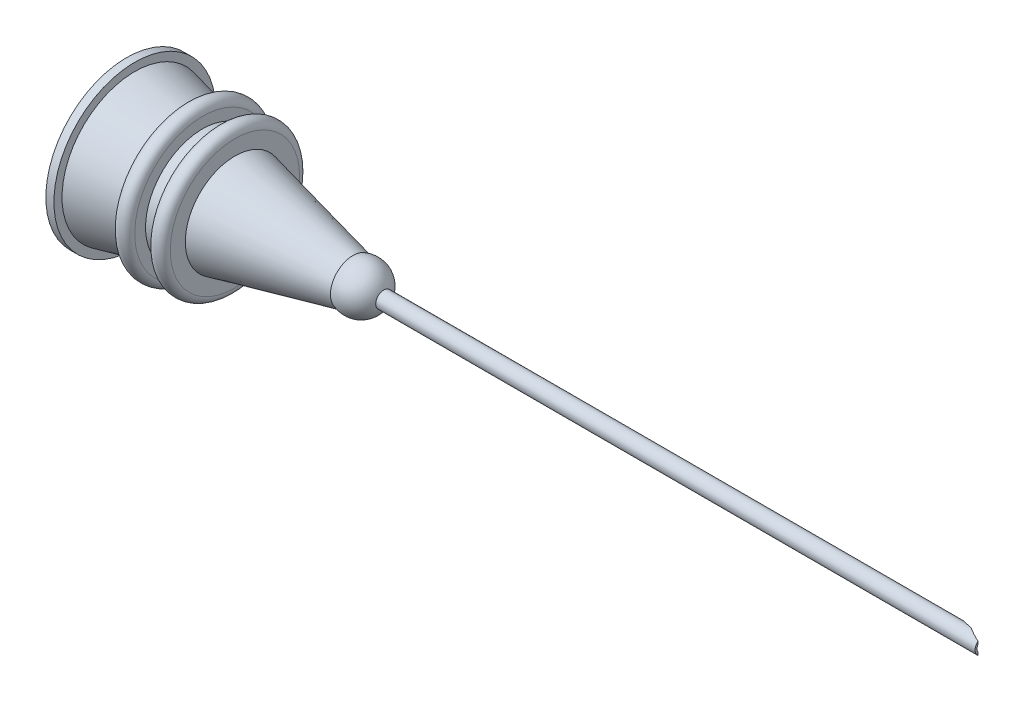
ISO-10303-21;
HEADER;
FILE_DESCRIPTION(('STEP AP214'),'2;1');
FILE_NAME('part.step','',(''),(''),'','','');
FILE_SCHEMA(('AUTOMOTIVE_DESIGN { 1 0 10303 214 1 1 1 1 }'));
ENDSEC;
DATA;
#1=APPLICATION_CONTEXT('core data for automotive mechanical design processes');
#2=APPLICATION_PROTOCOL_DEFINITION('international standard','automotive_design',2000,#1);
#3=PRODUCT_CONTEXT('',#1,'mechanical');
#4=PRODUCT('Part','Part','',(#3));
#5=PRODUCT_RELATED_PRODUCT_CATEGORY('part','',(#4));
#6=PRODUCT_DEFINITION_FORMATION('','',#4);
#7=PRODUCT_DEFINITION_CONTEXT('part definition',#1,'design');
#8=PRODUCT_DEFINITION('design','',#6,#7);
#9=PRODUCT_DEFINITION_SHAPE('','',#8);
#10=(LENGTH_UNIT() NAMED_UNIT(*) SI_UNIT(.MILLI.,.METRE.));
#11=(NAMED_UNIT(*) PLANE_ANGLE_UNIT() SI_UNIT($,.RADIAN.));
#12=(NAMED_UNIT(*) SI_UNIT($,.STERADIAN.) SOLID_ANGLE_UNIT());
#13=UNCERTAINTY_MEASURE_WITH_UNIT(LENGTH_MEASURE(1.E-05),#10,'distance_accuracy_value','');
#14=(GEOMETRIC_REPRESENTATION_CONTEXT(3) GLOBAL_UNCERTAINTY_ASSIGNED_CONTEXT((#13)) GLOBAL_UNIT_ASSIGNED_CONTEXT((#10,
#11,#12)) REPRESENTATION_CONTEXT('',''));
#15=CARTESIAN_POINT('',(0.,0.,0.));
#16=DIRECTION('',(0.,0.,1.));
#17=DIRECTION('',(1.,0.,0.));
#18=AXIS2_PLACEMENT_3D('',#15,#16,#17);
#19=CARTESIAN_POINT('',(0.517813696824794,0.,0.));
#20=DIRECTION('',(0.,0.,1.));
#21=DIRECTION('',(1.,0.,0.));
#22=AXIS2_PLACEMENT_3D('',#19,#20,#21);
#23=SPHERICAL_SURFACE('',#22,1.48218630317521);
#24=CARTESIAN_POINT('',(0.517813696824794,0.,0.));
#25=DIRECTION('',(-1.,0.,0.));
#26=DIRECTION('',(0.,0.,1.));
#27=AXIS2_PLACEMENT_3D('',#24,#25,#26);
#28=SPHERICAL_SURFACE('',#27,1.48218630317521);
#29=CARTESIAN_POINT('',(1.91311876644942,0.,0.));
#30=DIRECTION('',(-1.,0.,0.));
#31=DIRECTION('',(0.,0.,1.));
#32=AXIS2_PLACEMENT_3D('',#29,#30,#31);
#33=CIRCLE('',#32,0.5);
#34=CARTESIAN_POINT('',(1.91311876644942,0.,0.5));
#35=VERTEX_POINT('',#34);
#36=EDGE_CURVE('E116',#35,#35,#33,.F.);
#37=ORIENTED_EDGE('',*,*,#36,.F.);
#38=EDGE_LOOP('',(#37));
#39=FACE_BOUND('',#38,.T.);
#40=CARTESIAN_POINT('',(0.,0.,0.));
#41=DIRECTION('',(1.,0.,0.));
#42=DIRECTION('',(0.,0.,-1.));
#43=AXIS2_PLACEMENT_3D('',#40,#41,#42);
#44=CIRCLE('',#43,1.38879271768714);
#45=CARTESIAN_POINT('',(0.,0.,-1.38879271768714));
#46=VERTEX_POINT('',#45);
#47=EDGE_CURVE('E104',#46,#46,#44,.T.);
#48=ORIENTED_EDGE('',*,*,#47,.T.);
#49=EDGE_LOOP('',(#48));
#50=FACE_BOUND('',#49,.T.);
#51=ADVANCED_FACE('F45',(#39,#50),#28,.T.);
#52=CARTESIAN_POINT('',(0.,0.,0.));
#53=DIRECTION('',(-1.,0.,0.));
#54=DIRECTION('',(0.,0.,1.));
#55=AXIS2_PLACEMENT_3D('',#52,#53,#54);
#56=CONICAL_SURFACE('',#55,1.38879271768714,0.226465864034917);
#57=CARTESIAN_POINT('',(-7.3,0.,0.));
#58=DIRECTION('',(1.,0.,0.));
#59=DIRECTION('',(0.,0.,-1.));
#60=AXIS2_PLACEMENT_3D('',#57,#58,#59);
#61=CIRCLE('',#60,3.07084806558869);
#62=CARTESIAN_POINT('',(-7.3,0.,-3.07084806558869));
#63=VERTEX_POINT('',#62);
#64=EDGE_CURVE('E107',#63,#63,#61,.T.);
#65=ORIENTED_EDGE('',*,*,#64,.T.);
#66=EDGE_LOOP('',(#65));
#67=FACE_BOUND('',#66,.T.);
#68=ORIENTED_EDGE('',*,*,#47,.F.);
#69=EDGE_LOOP('',(#68));
#70=FACE_BOUND('',#69,.T.);
#71=ADVANCED_FACE('F199',(#67,#70),#56,.T.);
#72=CARTESIAN_POINT('',(-7.3,4.,0.));
#73=DIRECTION('',(1.,0.,0.));
#74=DIRECTION('',(0.,0.,-1.));
#75=AXIS2_PLACEMENT_3D('',#72,#73,#74);
#76=PLANE('',#75);
#77=CARTESIAN_POINT('',(-7.3,0.,0.));
#78=DIRECTION('',(1.,0.,0.));
#79=DIRECTION('',(0.,0.,-1.));
#80=AXIS2_PLACEMENT_3D('',#77,#78,#79);
#81=CIRCLE('',#80,4.);
#82=CARTESIAN_POINT('',(-7.3,0.,-4.));
#83=VERTEX_POINT('',#82);
#84=EDGE_CURVE('E214',#83,#83,#81,.T.);
#85=ORIENTED_EDGE('',*,*,#84,.T.);
#86=EDGE_LOOP('',(#85));
#87=FACE_BOUND('',#86,.T.);
#88=ORIENTED_EDGE('',*,*,#64,.F.);
#89=EDGE_LOOP('',(#88));
#90=FACE_BOUND('',#89,.T.);
#91=ADVANCED_FACE('F196',(#87,#90),#76,.T.);
#92=CARTESIAN_POINT('',(-7.8,0.,0.));
#93=DIRECTION('',(1.,0.,0.));
#94=DIRECTION('',(0.,0.,-1.));
#95=AXIS2_PLACEMENT_3D('',#92,#93,#94);
#96=TOROIDAL_SURFACE('',#95,4.,0.5);
#97=CARTESIAN_POINT('',(-8.3,0.,0.));
#98=DIRECTION('',(1.,0.,0.));
#99=DIRECTION('',(0.,0.,-1.));
#100=AXIS2_PLACEMENT_3D('',#97,#98,#99);
#101=CIRCLE('',#100,4.);
#102=CARTESIAN_POINT('',(-8.3,0.,-4.));
#103=VERTEX_POINT('',#102);
#104=EDGE_CURVE('E218',#103,#103,#101,.T.);
#105=ORIENTED_EDGE('',*,*,#104,.T.);
#106=EDGE_LOOP('',(#105));
#107=FACE_BOUND('',#106,.T.);
#108=ORIENTED_EDGE('',*,*,#84,.F.);
#109=EDGE_LOOP('',(#108));
#110=FACE_BOUND('',#109,.T.);
#111=ADVANCED_FACE('F192',(#107,#110),#96,.T.);
#112=CARTESIAN_POINT('',(-8.3,4.,0.));
#113=DIRECTION('',(-1.,0.,0.));
#114=DIRECTION('',(0.,0.,1.));
#115=AXIS2_PLACEMENT_3D('',#112,#113,#114);
#116=PLANE('',#115);
#117=CARTESIAN_POINT('',(-8.3,0.,0.));
#118=DIRECTION('',(1.,0.,0.));
#119=DIRECTION('',(0.,0.,-1.));
#120=AXIS2_PLACEMENT_3D('',#117,#118,#119);
#121=CIRCLE('',#120,3.30126660639712);
#122=CARTESIAN_POINT('',(-8.3,0.,-3.30126660639712));
#123=VERTEX_POINT('',#122);
#124=EDGE_CURVE('E224',#123,#123,#121,.T.);
#125=ORIENTED_EDGE('',*,*,#124,.T.);
#126=EDGE_LOOP('',(#125));
#127=FACE_BOUND('',#126,.T.);
#128=ORIENTED_EDGE('',*,*,#104,.F.);
#129=EDGE_LOOP('',(#128));
#130=FACE_BOUND('',#129,.T.);
#131=ADVANCED_FACE('F188',(#127,#130),#116,.T.);
#132=CARTESIAN_POINT('',(-8.3,0.,0.));
#133=DIRECTION('',(-1.,0.,0.));
#134=DIRECTION('',(0.,0.,1.));
#135=AXIS2_PLACEMENT_3D('',#132,#133,#134);
#136=CONICAL_SURFACE('',#135,3.30126660639712,0.226465864034917);
#137=CARTESIAN_POINT('',(-9.3,0.,0.));
#138=DIRECTION('',(1.,0.,0.));
#139=DIRECTION('',(0.,0.,-1.));
#140=AXIS2_PLACEMENT_3D('',#137,#138,#139);
#141=CIRCLE('',#140,3.53168514720555);
#142=CARTESIAN_POINT('',(-9.3,0.,-3.53168514720555));
#143=VERTEX_POINT('',#142);
#144=EDGE_CURVE('E228',#143,#143,#141,.T.);
#145=ORIENTED_EDGE('',*,*,#144,.T.);
#146=EDGE_LOOP('',(#145));
#147=FACE_BOUND('',#146,.T.);
#148=ORIENTED_EDGE('',*,*,#124,.F.);
#149=EDGE_LOOP('',(#148));
#150=FACE_BOUND('',#149,.T.);
#151=ADVANCED_FACE('F184',(#147,#150),#136,.T.);
#152=CARTESIAN_POINT('',(-9.3,4.2,0.));
#153=DIRECTION('',(1.,0.,0.));
#154=DIRECTION('',(0.,0.,-1.));
#155=AXIS2_PLACEMENT_3D('',#152,#153,#154);
#156=PLANE('',#155);
#157=CARTESIAN_POINT('',(-9.3,0.,0.));
#158=DIRECTION('',(1.,0.,0.));
#159=DIRECTION('',(0.,0.,-1.));
#160=AXIS2_PLACEMENT_3D('',#157,#158,#159);
#161=CIRCLE('',#160,4.2);
#162=CARTESIAN_POINT('',(-9.3,0.,-4.2));
#163=VERTEX_POINT('',#162);
#164=EDGE_CURVE('E232',#163,#163,#161,.T.);
#165=ORIENTED_EDGE('',*,*,#164,.T.);
#166=EDGE_LOOP('',(#165));
#167=FACE_BOUND('',#166,.T.);
#168=ORIENTED_EDGE('',*,*,#144,.F.);
#169=EDGE_LOOP('',(#168));
#170=FACE_BOUND('',#169,.T.);
#171=ADVANCED_FACE('F180',(#167,#170),#156,.T.);
#172=CARTESIAN_POINT('',(-9.8,0.,0.));
#173=DIRECTION('',(1.,0.,0.));
#174=DIRECTION('',(0.,0.,-1.));
#175=AXIS2_PLACEMENT_3D('',#172,#173,#174);
#176=TOROIDAL_SURFACE('',#175,4.2,0.5);
#177=CARTESIAN_POINT('',(-10.3,0.,0.));
#178=DIRECTION('',(1.,0.,0.));
#179=DIRECTION('',(0.,0.,-1.));
#180=AXIS2_PLACEMENT_3D('',#177,#178,#179);
#181=CIRCLE('',#180,4.2);
#182=CARTESIAN_POINT('',(-10.3,0.,-4.2));
#183=VERTEX_POINT('',#182);
#184=EDGE_CURVE('E236',#183,#183,#181,.T.);
#185=ORIENTED_EDGE('',*,*,#184,.T.);
#186=EDGE_LOOP('',(#185));
#187=FACE_BOUND('',#186,.T.);
#188=ORIENTED_EDGE('',*,*,#164,.F.);
#189=EDGE_LOOP('',(#188));
#190=FACE_BOUND('',#189,.T.);
#191=ADVANCED_FACE('F176',(#187,#190),#176,.T.);
#192=CARTESIAN_POINT('',(-10.3,4.2,0.));
#193=DIRECTION('',(-1.,0.,0.));
#194=DIRECTION('',(0.,0.,1.));
#195=AXIS2_PLACEMENT_3D('',#192,#193,#194);
#196=PLANE('',#195);
#197=CARTESIAN_POINT('',(-10.3,0.,0.));
#198=DIRECTION('',(1.,0.,0.));
#199=DIRECTION('',(0.,0.,-1.));
#200=AXIS2_PLACEMENT_3D('',#197,#198,#199);
#201=CIRCLE('',#200,3.76210368801398);
#202=CARTESIAN_POINT('',(-10.3,0.,-3.76210368801398));
#203=VERTEX_POINT('',#202);
#204=EDGE_CURVE('E240',#203,#203,#201,.T.);
#205=ORIENTED_EDGE('',*,*,#204,.T.);
#206=EDGE_LOOP('',(#205));
#207=FACE_BOUND('',#206,.T.);
#208=ORIENTED_EDGE('',*,*,#184,.F.);
#209=EDGE_LOOP('',(#208));
#210=FACE_BOUND('',#209,.T.);
#211=ADVANCED_FACE('F172',(#207,#210),#196,.T.);
#212=CARTESIAN_POINT('',(-10.3,0.,0.));
#213=DIRECTION('',(-1.,0.,0.));
#214=DIRECTION('',(0.,0.,1.));
#215=AXIS2_PLACEMENT_3D('',#212,#213,#214);
#216=CONICAL_SURFACE('',#215,3.76210368801398,0.226465864034916);
#217=CARTESIAN_POINT('',(-13.5,0.,0.));
#218=DIRECTION('',(1.,0.,0.));
#219=DIRECTION('',(0.,0.,-1.));
#220=AXIS2_PLACEMENT_3D('',#217,#218,#219);
#221=CIRCLE('',#220,4.49944301860096);
#222=CARTESIAN_POINT('',(-13.5,0.,-4.49944301860096));
#223=VERTEX_POINT('',#222);
#224=EDGE_CURVE('E244',#223,#223,#221,.T.);
#225=ORIENTED_EDGE('',*,*,#224,.T.);
#226=EDGE_LOOP('',(#225));
#227=FACE_BOUND('',#226,.T.);
#228=ORIENTED_EDGE('',*,*,#204,.F.);
#229=EDGE_LOOP('',(#228));
#230=FACE_BOUND('',#229,.T.);
#231=ADVANCED_FACE('F168',(#227,#230),#216,.T.);
#232=CARTESIAN_POINT('',(-13.5,4.49944301860096,0.));
#233=DIRECTION('',(1.,0.,0.));
#234=DIRECTION('',(0.,0.,-1.));
#235=AXIS2_PLACEMENT_3D('',#232,#233,#234);
#236=PLANE('',#235);
#237=CARTESIAN_POINT('',(-13.5,0.,0.));
#238=DIRECTION('',(1.,0.,0.));
#239=DIRECTION('',(0.,0.,-1.));
#240=AXIS2_PLACEMENT_3D('',#237,#238,#239);
#241=CIRCLE('',#240,5.);
#242=CARTESIAN_POINT('',(-13.5,0.,-5.));
#243=VERTEX_POINT('',#242);
#244=EDGE_CURVE('E248',#243,#243,#241,.T.);
#245=ORIENTED_EDGE('',*,*,#244,.T.);
#246=EDGE_LOOP('',(#245));
#247=FACE_BOUND('',#246,.T.);
#248=ORIENTED_EDGE('',*,*,#224,.F.);
#249=EDGE_LOOP('',(#248));
#250=FACE_BOUND('',#249,.T.);
#251=ADVANCED_FACE('F164',(#247,#250),#236,.T.);
#252=CARTESIAN_POINT('',(-1.,0.,0.));
#253=DIRECTION('',(1.,0.,0.));
#254=DIRECTION('',(0.,0.,-1.));
#255=AXIS2_PLACEMENT_3D('',#252,#253,#254);
#256=CYLINDRICAL_SURFACE('',#255,5.);
#257=CARTESIAN_POINT('',(-14.,0.,0.));
#258=DIRECTION('',(1.,0.,0.));
#259=DIRECTION('',(0.,0.,-1.));
#260=AXIS2_PLACEMENT_3D('',#257,#258,#259);
#261=CIRCLE('',#260,5.);
#262=CARTESIAN_POINT('',(-14.,0.,-5.));
#263=VERTEX_POINT('',#262);
#264=EDGE_CURVE('E252',#263,#263,#261,.T.);
#265=ORIENTED_EDGE('',*,*,#264,.T.);
#266=EDGE_LOOP('',(#265));
#267=FACE_BOUND('',#266,.T.);
#268=ORIENTED_EDGE('',*,*,#244,.F.);
#269=EDGE_LOOP('',(#268));
#270=FACE_BOUND('',#269,.T.);
#271=ADVANCED_FACE('F160',(#267,#270),#256,.T.);
#272=CARTESIAN_POINT('',(-14.,5.,0.));
#273=DIRECTION('',(-1.,0.,0.));
#274=DIRECTION('',(0.,0.,1.));
#275=AXIS2_PLACEMENT_3D('',#272,#273,#274);
#276=PLANE('',#275);
#277=CARTESIAN_POINT('',(-14.,0.,0.));
#278=DIRECTION('',(1.,0.,0.));
#279=DIRECTION('',(0.,0.,-1.));
#280=AXIS2_PLACEMENT_3D('',#277,#278,#279);
#281=CIRCLE('',#280,3.845);
#282=CARTESIAN_POINT('',(-14.,0.,3.845));
#283=VERTEX_POINT('',#282);
#284=EDGE_CURVE('E256',#283,#283,#281,.T.);
#285=ORIENTED_EDGE('',*,*,#284,.T.);
#286=EDGE_LOOP('',(#285));
#287=FACE_BOUND('',#286,.T.);
#288=ORIENTED_EDGE('',*,*,#264,.F.);
#289=EDGE_LOOP('',(#288));
#290=FACE_BOUND('',#289,.T.);
#291=ADVANCED_FACE('F156',(#287,#290),#276,.T.);
#292=CARTESIAN_POINT('',(-14.,0.,0.));
#293=DIRECTION('',(-1.,0.,0.));
#294=DIRECTION('',(0.,0.,1.));
#295=AXIS2_PLACEMENT_3D('',#292,#293,#294);
#296=CONICAL_SURFACE('',#295,3.845,0.226465864034917);
#297=CARTESIAN_POINT('',(-1.,0.,0.));
#298=DIRECTION('',(1.,0.,0.));
#299=DIRECTION('',(0.,0.,-1.));
#300=AXIS2_PLACEMENT_3D('',#297,#298,#299);
#301=CIRCLE('',#300,0.84955896949039);
#302=CARTESIAN_POINT('',(-1.,0.,0.84955896949039));
#303=VERTEX_POINT('',#302);
#304=EDGE_CURVE('E260',#303,#303,#301,.T.);
#305=CARTESIAN_POINT('',(-1.,0.,0.84955896949039));
#306=CARTESIAN_POINT('',(-1.13541666666667,0.,0.880761480224865));
#307=CARTESIAN_POINT('',(-1.27083333333333,0.,0.91196399095934));
#308=CARTESIAN_POINT('',(-1.54166666666667,0.,0.974369012428291));
#309=CARTESIAN_POINT('',(-1.67708333333333,0.,1.00557152316277));
#310=CARTESIAN_POINT('',(-1.94791666666667,0.,1.06797654463172));
#311=CARTESIAN_POINT('',(-2.08333333333334,0.,1.09917905536619));
#312=CARTESIAN_POINT('',(-2.35416666666667,0.,1.16158407683514));
#313=CARTESIAN_POINT('',(-2.48958333333333,0.,1.19278658756962));
#314=CARTESIAN_POINT('',(-2.76041666666667,0.,1.25519160903857));
#315=CARTESIAN_POINT('',(-2.89583333333333,0.,1.28639411977304));
#316=CARTESIAN_POINT('',(-3.16666666666667,0.,1.34879914124199));
#317=CARTESIAN_POINT('',(-3.30208333333333,0.,1.38000165197647));
#318=CARTESIAN_POINT('',(-3.57291666666667,0.,1.44240667344542));
#319=CARTESIAN_POINT('',(-3.70833333333333,0.,1.47360918417989));
#320=CARTESIAN_POINT('',(-3.97916666666667,0.,1.53601420564884));
#321=CARTESIAN_POINT('',(-4.11458333333334,0.,1.56721671638332));
#322=CARTESIAN_POINT('',(-4.38541666666667,0.,1.62962173785227));
#323=CARTESIAN_POINT('',(-4.52083333333333,0.,1.66082424858674));
#324=CARTESIAN_POINT('',(-4.79166666666667,0.,1.72322927005569));
#325=CARTESIAN_POINT('',(-4.92708333333333,0.,1.75443178079017));
#326=CARTESIAN_POINT('',(-5.19791666666667,0.,1.81683680225912));
#327=CARTESIAN_POINT('',(-5.33333333333333,0.,1.84803931299359));
#328=CARTESIAN_POINT('',(-5.60416666666667,0.,1.91044433446254));
#329=CARTESIAN_POINT('',(-5.73958333333333,0.,1.94164684519702));
#330=CARTESIAN_POINT('',(-6.01041666666667,0.,2.00405186666597));
#331=CARTESIAN_POINT('',(-6.14583333333334,0.,2.03525437740044));
#332=CARTESIAN_POINT('',(-6.41666666666667,0.,2.0976593988694));
#333=CARTESIAN_POINT('',(-6.55208333333334,0.,2.12886190960387));
#334=CARTESIAN_POINT('',(-6.82291666666667,0.,2.19126693107282));
#335=CARTESIAN_POINT('',(-6.95833333333334,0.,2.2224694418073));
#336=CARTESIAN_POINT('',(-7.22916666666667,0.,2.28487446327625));
#337=CARTESIAN_POINT('',(-7.36458333333334,0.,2.31607697401072));
#338=CARTESIAN_POINT('',(-7.63541666666667,0.,2.37848199547967));
#339=CARTESIAN_POINT('',(-7.77083333333334,0.,2.40968450621415));
#340=CARTESIAN_POINT('',(-8.04166666666667,0.,2.4720895276831));
#341=CARTESIAN_POINT('',(-8.17708333333334,0.,2.50329203841757));
#342=CARTESIAN_POINT('',(-8.44791666666667,0.,2.56569705988652));
#343=CARTESIAN_POINT('',(-8.58333333333334,0.,2.596899570621));
#344=CARTESIAN_POINT('',(-8.85416666666667,0.,2.65930459208995));
#345=CARTESIAN_POINT('',(-8.98958333333334,0.,2.69050710282442));
#346=CARTESIAN_POINT('',(-9.26041666666667,0.,2.75291212429337));
#347=CARTESIAN_POINT('',(-9.39583333333334,0.,2.78411463502785));
#348=CARTESIAN_POINT('',(-9.66666666666667,0.,2.8465196564968));
#349=CARTESIAN_POINT('',(-9.80208333333334,0.,2.87772216723127));
#350=CARTESIAN_POINT('',(-10.0729166666667,0.,2.94012718870022));
#351=CARTESIAN_POINT('',(-10.2083333333333,0.,2.9713296994347));
#352=CARTESIAN_POINT('',(-10.4791666666667,0.,3.03373472090365));
#353=CARTESIAN_POINT('',(-10.6145833333333,0.,3.06493723163812));
#354=CARTESIAN_POINT('',(-10.8854166666667,0.,3.12734225310707));
#355=CARTESIAN_POINT('',(-11.0208333333333,0.,3.15854476384155));
#356=CARTESIAN_POINT('',(-11.2916666666667,0.,3.2209497853105));
#357=CARTESIAN_POINT('',(-11.4270833333333,0.,3.25215229604497));
#358=CARTESIAN_POINT('',(-11.6979166666667,0.,3.31455731751393));
#359=CARTESIAN_POINT('',(-11.8333333333333,0.,3.3457598282484));
#360=CARTESIAN_POINT('',(-12.1041666666667,0.,3.40816484971735));
#361=CARTESIAN_POINT('',(-12.2395833333333,0.,3.43936736045183));
#362=CARTESIAN_POINT('',(-12.5104166666667,0.,3.50177238192078));
#363=CARTESIAN_POINT('',(-12.6458333333333,0.,3.53297489265525));
#364=CARTESIAN_POINT('',(-12.9166666666667,0.,3.5953799141242));
#365=CARTESIAN_POINT('',(-13.0520833333333,0.,3.62658242485868));
#366=CARTESIAN_POINT('',(-13.3229166666667,0.,3.68898744632763));
#367=CARTESIAN_POINT('',(-13.4583333333333,0.,3.7201899570621));
#368=CARTESIAN_POINT('',(-13.7291666666667,0.,3.78259497853105));
#369=CARTESIAN_POINT('',(-13.8645833333333,0.,3.81379748926553));
#370=CARTESIAN_POINT('',(-14.,0.,3.845));
#371=B_SPLINE_CURVE_WITH_KNOTS('',3,(#305,#306,#307,#308,#309,#310,#311,#312,#313,#314,#315,
#316,#317,#318,#319,#320,#321,#322,#323,#324,#325,#326,#327,#328,#329,#330,#331,#332,#333,#334,
#335,#336,#337,#338,#339,#340,#341,#342,#343,#344,#345,#346,#347,#348,#349,#350,#351,#352,#353,
#354,#355,#356,#357,#358,#359,#360,#361,#362,#363,#364,#365,#366,#367,#368,#369,#370),
.UNSPECIFIED.,.F.,.F.,(4,2,2,2,2,2,2,2,2,2,2,2,2,2,2,2,2,2,2,2,2,2,2,2,2,2,2,2,2,2,2,2,4),(0.,
0.416894989877806,0.833789979755611,1.25068496963342,1.66757995951122,2.08447494938903,
2.50136993926683,2.91826492914464,3.33515991902244,3.75205490890025,4.16894989877805,
4.58584488865586,5.00273987853366,5.41963486841147,5.83652985828928,6.25342484816708,
6.67031983804489,7.08721482792269,7.5041098178005,7.9210048076783,8.33789979755611,
8.75479478743391,9.17168977731172,9.58858476718952,10.0054797570673,10.4223747469451,
10.8392697368229,11.2561647267007,11.6730597165786,12.0899547064564,12.5068496963342,
12.923744686212,13.3406396760898),.UNSPECIFIED.);
#372=EDGE_CURVE('BSEAM152',#303,#283,#371,.T.);
#373=ORIENTED_EDGE('',*,*,#304,.T.);
#374=ORIENTED_EDGE('',*,*,#284,.F.);
#375=ORIENTED_EDGE('',*,*,#372,.T.);
#376=ORIENTED_EDGE('',*,*,#372,.F.);
#377=EDGE_LOOP('',(#373,#375,#374,#376));
#378=FACE_BOUND('',#377,.T.);
#379=ADVANCED_FACE('F152',(#378),#296,.F.);
#380=CARTESIAN_POINT('',(-1.,0.84955896949039,0.));
#381=DIRECTION('',(-1.,0.,0.));
#382=DIRECTION('',(0.,0.,1.));
#383=AXIS2_PLACEMENT_3D('',#380,#381,#382);
#384=PLANE('',#383);
#385=ORIENTED_EDGE('',*,*,#304,.F.);
#386=EDGE_LOOP('',(#385));
#387=FACE_BOUND('',#386,.T.);
#388=CARTESIAN_POINT('',(-1.,0.,0.));
#389=DIRECTION('',(-1.,0.,0.));
#390=DIRECTION('',(0.,0.,1.));
#391=AXIS2_PLACEMENT_3D('',#388,#389,#390);
#392=CIRCLE('',#391,0.375);
#393=CARTESIAN_POINT('',(-1.,0.,0.375));
#394=VERTEX_POINT('',#393);
#395=EDGE_CURVE('E134',#394,#394,#392,.T.);
#396=ORIENTED_EDGE('',*,*,#395,.F.);
#397=EDGE_LOOP('',(#396));
#398=FACE_BOUND('',#397,.T.);
#399=ADVANCED_FACE('F147',(#387,#398),#384,.T.);
#400=CARTESIAN_POINT('',(39.,0.,0.));
#401=DIRECTION('',(-1.,0.,0.));
#402=DIRECTION('',(0.,0.,1.));
#403=AXIS2_PLACEMENT_3D('',#400,#401,#402);
#404=CYLINDRICAL_SURFACE('',#403,0.5);
#405=CARTESIAN_POINT('',(39.,-0.386572977257801,0.317114069782531));
#406=CARTESIAN_POINT('',(38.9360954434168,-0.402125419472233,0.298154035615708));
#407=CARTESIAN_POINT('',(38.8727008630785,-0.417236792147754,0.276878511594387));
#408=CARTESIAN_POINT('',(38.7466473372574,-0.445095209698728,0.229464844435769));
#409=CARTESIAN_POINT('',(38.6839979700152,-0.457822918532618,0.203290110999119));
#410=CARTESIAN_POINT('',(38.5579195716901,-0.479523882285672,0.145109499510552));
#411=CARTESIAN_POINT('',(38.4945439037696,-0.488345184723391,0.112927371885372));
#412=CARTESIAN_POINT('',(38.3701481941632,-0.499323613184435,0.0436304461810781));
#413=CARTESIAN_POINT('',(38.3091201389364,-0.501505855837341,0.00653479429242062));
#414=CARTESIAN_POINT('',(38.2023040166035,-0.496867300254244,-0.0641066769391839));
#415=CARTESIAN_POINT('',(38.1559267745463,-0.491775307223263,-0.0968569881695751));
#416=CARTESIAN_POINT('',(38.0665158152605,-0.47357308725145,-0.164107706046127));
#417=CARTESIAN_POINT('',(38.0234572944663,-0.46053054222652,-0.198591109697322));
#418=CARTESIAN_POINT('',(37.9575807025033,-0.431088594546146,-0.2544438185581));
#419=CARTESIAN_POINT('',(37.9333190857186,-0.417880025876148,-0.275785491572562));
#420=CARTESIAN_POINT('',(37.8871269433048,-0.386913086159473,-0.317769939136914));
#421=CARTESIAN_POINT('',(37.8651958980229,-0.369155732390048,-0.338412868784692));
#422=CARTESIAN_POINT('',(37.8285340627194,-0.332694869617803,-0.37393362027906));
#423=CARTESIAN_POINT('',(37.8132392612486,-0.314884674309928,-0.389140660580201));
#424=CARTESIAN_POINT('',(37.7851722700016,-0.276006922013536,-0.417610308758644));
#425=CARTESIAN_POINT('',(37.7723968406343,-0.254943611125883,-0.430875407990774));
#426=CARTESIAN_POINT('',(37.7518709305866,-0.213700051822121,-0.452522873736013));
#427=CARTESIAN_POINT('',(37.7436333695448,-0.193998715444623,-0.461352999755347));
#428=CARTESIAN_POINT('',(37.7295738890844,-0.152854387172426,-0.476566466950086));
#429=CARTESIAN_POINT('',(37.7237509401009,-0.131412142255882,-0.482950850875275));
#430=CARTESIAN_POINT('',(37.7147620338446,-0.0872157142358334,-0.492857465121563));
#431=CARTESIAN_POINT('',(37.7116091623699,-0.0644556472258586,-0.496365596558443));
#432=CARTESIAN_POINT('',(37.7081722573007,-0.0184543824026786,-0.500191440107059));
#433=CARTESIAN_POINT('',(37.7078874245628,0.00478667957853374,-0.500510040941705));
#434=CARTESIAN_POINT('',(37.710099449159,0.0489732197115171,-0.498045710025768));
#435=CARTESIAN_POINT('',(37.7123621326092,0.0699460339851503,-0.495523870452142));
#436=CARTESIAN_POINT('',(37.7191973609768,0.111036101806699,-0.48796251304803));
#437=CARTESIAN_POINT('',(37.7237697496896,0.131153413112263,-0.482923165476043));
#438=CARTESIAN_POINT('',(37.7351428628283,0.170410339854032,-0.470522923497989));
#439=CARTESIAN_POINT('',(37.7419819645747,0.189526045618179,-0.463122134572526));
#440=CARTESIAN_POINT('',(37.7576167206421,0.226050190810515,-0.446436215667555));
#441=CARTESIAN_POINT('',(37.7664133200831,0.24345779966462,-0.437150175640817));
#442=CARTESIAN_POINT('',(37.7894840299882,0.282828182192459,-0.413190656689474));
#443=CARTESIAN_POINT('',(37.8045546695053,0.303908506318742,-0.397830809271054));
#444=CARTESIAN_POINT('',(37.8373162346832,0.342313048794166,-0.365319052933265));
#445=CARTESIAN_POINT('',(37.8550121064217,0.359630021601678,-0.348163779706269));
#446=CARTESIAN_POINT('',(37.8998288705552,0.396811000030229,-0.305963723856585));
#447=CARTESIAN_POINT('',(37.9279175934797,0.414993781165968,-0.280471835462043));
#448=CARTESIAN_POINT('',(37.9868919744583,0.445351381981897,-0.229240048203932));
#449=CARTESIAN_POINT('',(38.0177808417559,0.457519202212994,-0.203499895770721));
#450=CARTESIAN_POINT('',(38.099454860577,0.482313876530425,-0.138477825088036));
#451=CARTESIAN_POINT('',(38.1516949822587,0.491381781775215,-0.0996848380160991));
#452=CARTESIAN_POINT('',(38.2594948919966,0.500765763311996,-0.0253883614650388));
#453=CARTESIAN_POINT('',(38.315074036187,0.501024618472414,0.0100921281803401));
#454=CARTESIAN_POINT('',(38.4222221719907,0.495497614084553,0.0733168404916953));
#455=CARTESIAN_POINT('',(38.4735830776506,0.490356218094688,0.101482642582871));
#456=CARTESIAN_POINT('',(38.577617454851,0.476351441470093,0.154400741873293));
#457=CARTESIAN_POINT('',(38.6302928543968,0.467482249699196,0.179147629065476));
#458=CARTESIAN_POINT('',(38.7354302736702,0.447369420148579,0.224642883250705));
#459=CARTESIAN_POINT('',(38.7878703789597,0.43618375984661,0.245468753739364));
#460=CARTESIAN_POINT('',(38.8934178985428,0.412291767797409,0.283765868499238));
#461=CARTESIAN_POINT('',(38.9465224684637,0.399590687722908,0.301248181294207));
#462=CARTESIAN_POINT('',(39.,0.386572977257801,0.31711406978253));
#463=B_SPLINE_CURVE_WITH_KNOTS('',3,(#405,#406,#407,#408,#409,#410,#411,#412,#413,#414,#415,
#416,#417,#418,#419,#420,#421,#422,#423,#424,#425,#426,#427,#428,#429,#430,#431,#432,#433,#434,
#435,#436,#437,#438,#439,#440,#441,#442,#443,#444,#445,#446,#447,#448,#449,#450,#451,#452,#453,
#454,#455,#456,#457,#458,#459,#460,#461,#462),.UNSPECIFIED.,.F.,.F.,(4,2,2,2,2,2,2,2,2,2,2,2,2,
2,2,2,2,2,2,2,2,2,2,2,2,2,2,2,4),(0.,0.205405733911601,0.412411650226816,0.626882941224306,
0.840541837542388,1.01106175738708,1.18014995252939,1.28457928606694,1.38898528568575,
1.47259079331744,1.55608808371536,1.6251236928451,1.69412983558172,1.76347224537699,
1.83279533323691,1.89623133181943,1.9596630408203,2.02422879956652,2.08882579987956,
2.17869609768019,2.26873791836379,2.39422811477977,2.51986399902685,2.71585768973697,
2.91312425942792,3.08926213727561,3.26567561494289,3.43811581976451,3.60997490373909),.UNSPECIFIED.);
#464=CARTESIAN_POINT('',(39.,-0.386572977257801,0.317114069782531));
#465=VERTEX_POINT('',#464);
#466=CARTESIAN_POINT('',(38.2040429200747,-0.49593768575301,-0.0636066965810067));
#467=VERTEX_POINT('',#466);
#468=EDGE_CURVE('E67',#465,#467,#463,.T.);
#469=ORIENTED_EDGE('',*,*,#468,.F.);
#470=CARTESIAN_POINT('',(39.,0.,0.));
#471=DIRECTION('',(-1.,0.,0.));
#472=DIRECTION('',(0.,0.,1.));
#473=AXIS2_PLACEMENT_3D('',#470,#471,#472);
#474=CIRCLE('',#473,0.5);
#475=CARTESIAN_POINT('',(39.,0.386572977257801,0.317114069782531));
#476=VERTEX_POINT('',#475);
#477=EDGE_CURVE('E264',#465,#476,#474,.T.);
#478=ORIENTED_EDGE('',*,*,#477,.T.);
#479=CARTESIAN_POINT('',(38.2040429200747,0.49593768575301,-0.0636066965810081));
#480=VERTEX_POINT('',#479);
#481=EDGE_CURVE('E135',#480,#476,#463,.T.);
#482=ORIENTED_EDGE('',*,*,#481,.F.);
#483=CARTESIAN_POINT('',(39.,-0.499209675392905,0.0281016012730621));
#484=CARTESIAN_POINT('',(38.9582729968212,-0.499204377097201,0.0281015349493212));
#485=CARTESIAN_POINT('',(38.916549867298,-0.499252381092361,0.0273552961111787));
#486=CARTESIAN_POINT('',(38.8331567635593,-0.49940888148754,0.0243717059348792));
#487=CARTESIAN_POINT('',(38.7914867897248,-0.499517378318709,0.0221343439690285));
#488=CARTESIAN_POINT('',(38.6665075920042,-0.499864765326064,0.0131789818007824));
#489=CARTESIAN_POINT('',(38.5833476699778,-0.500125305587081,0.00421770654632282));
#490=CARTESIAN_POINT('',(38.4158997582506,-0.499751431876839,-0.0199196343623046));
#491=CARTESIAN_POINT('',(38.3316328216984,-0.499095317269073,-0.0352401500493152));
#492=CARTESIAN_POINT('',(38.164553287991,-0.495138117535959,-0.0719972925074515));
#493=CARTESIAN_POINT('',(38.0817392695266,-0.491839783764163,-0.0934275422438075));
#494=CARTESIAN_POINT('',(37.9596260184798,-0.483004849977743,-0.12983310872421));
#495=CARTESIAN_POINT('',(37.919514246615,-0.479445660822806,-0.142586733725547));
#496=CARTESIAN_POINT('',(37.8399266734205,-0.470615795934044,-0.169476126932031));
#497=CARTESIAN_POINT('',(37.8004510358476,-0.465344686669859,-0.183612244608214));
#498=CARTESIAN_POINT('',(37.7226397309974,-0.45261829887057,-0.213053826261784));
#499=CARTESIAN_POINT('',(37.6842976571918,-0.445180020684197,-0.228349527874207));
#500=CARTESIAN_POINT('',(37.6087531110232,-0.427451903538171,-0.260028935862344));
#501=CARTESIAN_POINT('',(37.5715496759771,-0.417164551736396,-0.276411683835901));
#502=CARTESIAN_POINT('',(37.5062834934732,-0.395390952318581,-0.306488199466778));
#503=CARTESIAN_POINT('',(37.4779253668982,-0.384595952850992,-0.320034894661835));
#504=CARTESIAN_POINT('',(37.4225183227676,-0.360074486966645,-0.347397455345641));
#505=CARTESIAN_POINT('',(37.3954724321644,-0.346341604589122,-0.36121384882176));
#506=CARTESIAN_POINT('',(37.3430915224677,-0.315088623925855,-0.388792912279201));
#507=CARTESIAN_POINT('',(37.3177790634475,-0.297527822950048,-0.402553246539063));
#508=CARTESIAN_POINT('',(37.2703556780496,-0.257874900573414,-0.429028279604752));
#509=CARTESIAN_POINT('',(37.2482320943205,-0.235801584976067,-0.441747020672446));
#510=CARTESIAN_POINT('',(37.2179612961515,-0.197665902619285,-0.459508048614741));
#511=CARTESIAN_POINT('',(37.2080301349672,-0.183427212612789,-0.465413085893581));
#512=CARTESIAN_POINT('',(37.190121578179,-0.153381391279344,-0.476160047006589));
#513=CARTESIAN_POINT('',(37.1821434656214,-0.137574838509719,-0.481002360893086));
#514=CARTESIAN_POINT('',(37.1685824154372,-0.104375094231888,-0.489286385676838));
#515=CARTESIAN_POINT('',(37.1630276089241,-0.0869659696578358,-0.492711623940308));
#516=CARTESIAN_POINT('',(37.1549655777357,-0.0512004074786157,-0.497697411529435));
#517=CARTESIAN_POINT('',(37.1524539289191,-0.0328453856190262,-0.499260667747532));
#518=CARTESIAN_POINT('',(37.1508585466349,0.00156634357966108,-0.500253034659484));
#519=CARTESIAN_POINT('',(37.151356344078,0.0175973712835358,-0.499942683218809));
#520=CARTESIAN_POINT('',(37.1547773127958,0.0492952399726263,-0.497817497680163));
#521=CARTESIAN_POINT('',(37.1577008978731,0.0649620183536519,-0.496002406896518));
#522=CARTESIAN_POINT('',(37.1655243030541,0.0946734211657706,-0.49117393868801));
#523=CARTESIAN_POINT('',(37.1703106968616,0.108760003127207,-0.488229457076626));
#524=CARTESIAN_POINT('',(37.1815615706909,0.135980720432441,-0.481359104315636));
#525=CARTESIAN_POINT('',(37.1880265128015,0.149114592228259,-0.477432962935313));
#526=CARTESIAN_POINT('',(37.2064276627908,0.18151344138759,-0.466358794562786));
#527=CARTESIAN_POINT('',(37.2193824784853,0.200008031781764,-0.458649601543196));
#528=CARTESIAN_POINT('',(37.2477527558351,0.234407451612454,-0.442063003040655));
#529=CARTESIAN_POINT('',(37.2631750977269,0.250304780919909,-0.433182343666785));
#530=CARTESIAN_POINT('',(37.3060496204493,0.289028756530332,-0.408982458000984));
#531=CARTESIAN_POINT('',(37.334954057202,0.309901644436806,-0.39313514332263));
#532=CARTESIAN_POINT('',(37.3955518506894,0.346678167315857,-0.36112141012821));
#533=CARTESIAN_POINT('',(37.4272510313696,0.362571095219919,-0.344954382433326));
#534=CARTESIAN_POINT('',(37.4915842640336,0.390112137037711,-0.313428744684154));
#535=CARTESIAN_POINT('',(37.5241705725729,0.401862495567216,-0.298060079119302));
#536=CARTESIAN_POINT('',(37.5905664703613,0.422487066271297,-0.268021008248685));
#537=CARTESIAN_POINT('',(37.6243772103817,0.431358490397452,-0.253351291483802));
#538=CARTESIAN_POINT('',(37.7272935974065,0.454629766854619,-0.210652014731207));
#539=CARTESIAN_POINT('',(37.7977364861733,0.46563118825867,-0.184004914164836));
#540=CARTESIAN_POINT('',(37.9462455967494,0.482694576159062,-0.133297994057083));
#541=CARTESIAN_POINT('',(38.0244784659501,0.488305526994435,-0.109600893533228));
#542=CARTESIAN_POINT('',(38.1826443887403,0.495852822997459,-0.06769078324772));
#543=CARTESIAN_POINT('',(38.2625792683566,0.497784997284042,-0.0494840179064512));
#544=CARTESIAN_POINT('',(38.4234683694663,0.49988517094818,-0.0187379533236919));
#545=CARTESIAN_POINT('',(38.5044216738823,0.500054657626905,-0.00619388462595186));
#546=CARTESIAN_POINT('',(38.6669557608322,0.499920937792368,0.0131801115347331));
#547=CARTESIAN_POINT('',(38.7485360259365,0.499618086514061,0.0200143273170053));
#548=CARTESIAN_POINT('',(38.8585296171095,0.499357498767971,0.0253561308096153));
#549=CARTESIAN_POINT('',(38.8868362119571,0.499303577014988,0.0263864041183634));
#550=CARTESIAN_POINT('',(38.9434278288673,0.499229506723669,0.0277586177559925));
#551=CARTESIAN_POINT('',(38.9717128283486,0.499209312618932,0.0281014869007796));
#552=CARTESIAN_POINT('',(39.,0.499209675392905,0.028101601273062));
#553=B_SPLINE_CURVE_WITH_KNOTS('',3,(#483,#484,#485,#486,#487,#488,#489,#490,#491,#492,#493,
#494,#495,#496,#497,#498,#499,#500,#501,#502,#503,#504,#505,#506,#507,#508,#509,#510,#511,#512,
#513,#514,#515,#516,#517,#518,#519,#520,#521,#522,#523,#524,#525,#526,#527,#528,#529,#530,#531,
#532,#533,#534,#535,#536,#537,#538,#539,#540,#541,#542,#543,#544,#545,#546,#547,#548,#549,#550,
#551,#552),.UNSPECIFIED.,.F.,.F.,(4,2,2,2,2,2,2,2,2,2,2,2,2,2,2,2,2,2,2,2,2,2,2,2,2,2,2,2,2,2,2,
2,2,2,4),(0.,0.125166605636429,0.250334103383338,0.501024013465515,0.757750278369038,
1.01420956012644,1.14088407486508,1.26759069397908,1.3933289599301,1.51895780418115,
1.61852917636669,1.71832026093112,1.81922925012283,1.91972597604703,1.9745758236049,
2.02940550578035,2.08485576201355,2.14022530758878,2.18809024286712,2.23596334485684,
2.28128925989975,2.32662766599728,2.3977983050711,2.46917096412066,2.58556053123444,
2.7021986492119,2.81571435307716,2.92933966322871,3.15710428193817,3.40259365270081,
3.64836118623108,3.89392133189307,4.13929688622418,4.22426686570266,4.30912195672613),.UNSPECIFIED.);
#554=EDGE_CURVE('E125',#467,#480,#553,.T.);
#555=ORIENTED_EDGE('',*,*,#554,.F.);
#556=EDGE_LOOP('',(#469,#478,#482,#555));
#557=FACE_BOUND('',#556,.T.);
#558=ORIENTED_EDGE('',*,*,#36,.T.);
#559=EDGE_LOOP('',(#558));
#560=FACE_BOUND('',#559,.T.);
#561=ADVANCED_FACE('F142',(#557,#560),#404,.T.);
#562=CARTESIAN_POINT('',(39.,0.,0.));
#563=DIRECTION('',(-1.,0.,0.));
#564=DIRECTION('',(0.,0.,1.));
#565=AXIS2_PLACEMENT_3D('',#562,#563,#564);
#566=PLANE('',#565);
#567=ORIENTED_EDGE('',*,*,#477,.F.);
#568=DIRECTION('',(0.,1.,0.));
#569=VECTOR('',#568,1.);
#570=CARTESIAN_POINT('',(39.,-5.,0.317114069782531));
#571=LINE('',#570,#569);
#572=CARTESIAN_POINT('',(39.,-0.200159103580027,0.317114069782531));
#573=VERTEX_POINT('',#572);
#574=EDGE_CURVE('E100',#465,#573,#571,.T.);
#575=ORIENTED_EDGE('',*,*,#574,.T.);
#576=CARTESIAN_POINT('',(39.,0.,0.));
#577=DIRECTION('',(-1.,0.,0.));
#578=DIRECTION('',(0.,0.,1.));
#579=AXIS2_PLACEMENT_3D('',#576,#577,#578);
#580=CIRCLE('',#579,0.375);
#581=CARTESIAN_POINT('',(39.,0.200159103580027,0.317114069782531));
#582=VERTEX_POINT('',#581);
#583=EDGE_CURVE('E98',#573,#582,#580,.T.);
#584=ORIENTED_EDGE('',*,*,#583,.T.);
#585=EDGE_CURVE('E274',#582,#476,#571,.T.);
#586=ORIENTED_EDGE('',*,*,#585,.T.);
#587=EDGE_LOOP('',(#567,#575,#584,#586));
#588=FACE_BOUND('',#587,.T.);
#589=ADVANCED_FACE('F146',(#588),#566,.F.);
#590=CARTESIAN_POINT('',(39.,0.,0.));
#591=DIRECTION('',(-1.,0.,0.));
#592=DIRECTION('',(0.,0.,1.));
#593=AXIS2_PLACEMENT_3D('',#590,#591,#592);
#594=CYLINDRICAL_SURFACE('',#593,0.375);
#595=ORIENTED_EDGE('',*,*,#583,.F.);
#596=CARTESIAN_POINT('',(39.,-0.200159103580027,0.317114069782531));
#597=CARTESIAN_POINT('',(38.9790154799316,-0.210000273885779,0.310890974205532));
#598=CARTESIAN_POINT('',(38.9579012016985,-0.219350039291892,0.30436000800423));
#599=CARTESIAN_POINT('',(38.9155072557914,-0.237177685730083,0.290688255230528));
#600=CARTESIAN_POINT('',(38.8942276225355,-0.245655743239115,0.283547592628881));
#601=CARTESIAN_POINT('',(38.8302138490354,-0.269975262198464,0.261196724244773));
#602=CARTESIAN_POINT('',(38.7873595225104,-0.284677221061573,0.245073739948551));
#603=CARTESIAN_POINT('',(38.7012541301977,-0.311328241621921,0.210203674696645));
#604=CARTESIAN_POINT('',(38.6580040667329,-0.323244246061014,0.191428947304827));
#605=CARTESIAN_POINT('',(38.5719043325456,-0.343812685795357,0.151404905070238));
#606=CARTESIAN_POINT('',(38.5290543862675,-0.352467558090206,0.130157453664148));
#607=CARTESIAN_POINT('',(38.4376795273119,-0.366948645511649,0.0818634678321675));
#608=CARTESIAN_POINT('',(38.3892600348309,-0.372161488995642,0.0544245606055387));
#609=CARTESIAN_POINT('',(38.2940201643007,-0.376100508092523,-0.00339529931545443));
#610=CARTESIAN_POINT('',(38.2471954933764,-0.374845758569633,-0.0337673416124083));
#611=CARTESIAN_POINT('',(38.1694968919544,-0.3653472909044,-0.0874916647746027));
#612=CARTESIAN_POINT('',(38.1379792625586,-0.359265771540407,-0.110283938920793));
#613=CARTESIAN_POINT('',(38.0768592697431,-0.341715829713748,-0.156408386736999));
#614=CARTESIAN_POINT('',(38.0472537510114,-0.33025655399072,-0.179739579969564));
#615=CARTESIAN_POINT('',(38.0006308762872,-0.305701378831765,-0.217935759536015));
#616=CARTESIAN_POINT('',(37.9827643734552,-0.294497129639343,-0.23297390840241));
#617=CARTESIAN_POINT('',(37.9488119946885,-0.268770797810613,-0.262232355359161));
#618=CARTESIAN_POINT('',(37.9327238795838,-0.254252959604678,-0.276453670826157));
#619=CARTESIAN_POINT('',(37.9065158581787,-0.22545025065902,-0.300096123160978));
#620=CARTESIAN_POINT('',(37.8958829020933,-0.211916550284117,-0.309858733826957));
#621=CARTESIAN_POINT('',(37.8764623184699,-0.182710125758119,-0.327926331302122));
#622=CARTESIAN_POINT('',(37.8676722839479,-0.167040236346915,-0.336233217030901));
#623=CARTESIAN_POINT('',(37.8537652738784,-0.136721758946499,-0.349506670343509));
#624=CARTESIAN_POINT('',(37.8482725002233,-0.122392106473707,-0.354804967508856));
#625=CARTESIAN_POINT('',(37.8390996334425,-0.0926578812275019,-0.363702863571384));
#626=CARTESIAN_POINT('',(37.8354186168868,-0.0772538606267277,-0.367303327793591));
#627=CARTESIAN_POINT('',(37.8300668295787,-0.0456892741959589,-0.372551380894742));
#628=CARTESIAN_POINT('',(37.8284060731547,-0.0295253487522482,-0.374189240647353));
#629=CARTESIAN_POINT('',(37.8272383364174,0.00295521206421452,-0.375339963549577));
#630=CARTESIAN_POINT('',(37.8277308667442,0.019271811898886,-0.374853309520119));
#631=CARTESIAN_POINT('',(37.8307047515054,0.0501599791123281,-0.371927073736698));
#632=CARTESIAN_POINT('',(37.8330182183806,0.0647642467869021,-0.36965236995112));
#633=CARTESIAN_POINT('',(37.8393019135706,0.0932583506926755,-0.363511226196773));
#634=CARTESIAN_POINT('',(37.8432722880777,0.107148123761059,-0.359644645773888));
#635=CARTESIAN_POINT('',(37.8529132146132,0.134580770784004,-0.350332545831257));
#636=CARTESIAN_POINT('',(37.8586560880236,0.148075168910809,-0.344820273475208));
#637=CARTESIAN_POINT('',(37.8715228016472,0.173796697522965,-0.332600203058459));
#638=CARTESIAN_POINT('',(37.8786473642772,0.186023159912865,-0.325891779738322));
#639=CARTESIAN_POINT('',(37.8980372707755,0.215114730262698,-0.30785712683022));
#640=CARTESIAN_POINT('',(37.9110563645071,0.231111037464728,-0.29593628417607));
#641=CARTESIAN_POINT('',(37.9390792627192,0.260089107853619,-0.270828591850779));
#642=CARTESIAN_POINT('',(37.9540877838931,0.273063498351018,-0.257638754582423));
#643=CARTESIAN_POINT('',(37.9930207014919,0.301724695547818,-0.224222132315415));
#644=CARTESIAN_POINT('',(38.0178054978852,0.315793597018574,-0.203616756677692));
#645=CARTESIAN_POINT('',(38.0694491166928,0.338909116883709,-0.162258027483325));
#646=CARTESIAN_POINT('',(38.0963111833256,0.347947690976678,-0.141504490355472));
#647=CARTESIAN_POINT('',(38.1683482756634,0.366206591753051,-0.0879786945907722));
#648=CARTESIAN_POINT('',(38.2146605959689,0.372145931189312,-0.0556325523203304));
#649=CARTESIAN_POINT('',(38.3094270617135,0.376232694247634,0.00634324492088366));
#650=CARTESIAN_POINT('',(38.3578876524706,0.37435484383868,0.0359637716673226));
#651=CARTESIAN_POINT('',(38.4465277209361,0.365592793247223,0.0865460689627202));
#652=CARTESIAN_POINT('',(38.4864970313759,0.359746585820529,0.108074760797177));
#653=CARTESIAN_POINT('',(38.5669506553632,0.344836821912331,0.148950964389296));
#654=CARTESIAN_POINT('',(38.6074350957938,0.335772457364463,0.168297926714287));
#655=CARTESIAN_POINT('',(38.6886245460559,0.314860232240356,0.20476655002524));
#656=CARTESIAN_POINT('',(38.7293292956771,0.303015156383265,0.221890410845449));
#657=CARTESIAN_POINT('',(38.8107343085035,0.276718744930246,0.253933718352107));
#658=CARTESIAN_POINT('',(38.8514345530983,0.262269327445925,0.268854772802492));
#659=CARTESIAN_POINT('',(38.9100908450643,0.239313445141215,0.288864129432091));
#660=CARTESIAN_POINT('',(38.9281937484893,0.231932158495327,0.294831686404979));
#661=CARTESIAN_POINT('',(38.9642299834727,0.216539841554821,0.306311282450047));
#662=CARTESIAN_POINT('',(38.9821635767337,0.208530066487136,0.311824186538779));
#663=CARTESIAN_POINT('',(39.,0.200159103580027,0.317114069782531));
#664=B_SPLINE_CURVE_WITH_KNOTS('',3,(#596,#597,#598,#599,#600,#601,#602,#603,#604,#605,#606,
#607,#608,#609,#610,#611,#612,#613,#614,#615,#616,#617,#618,#619,#620,#621,#622,#623,#624,#625,
#626,#627,#628,#629,#630,#631,#632,#633,#634,#635,#636,#637,#638,#639,#640,#641,#642,#643,#644,
#645,#646,#647,#648,#649,#650,#651,#652,#653,#654,#655,#656,#657,#658,#659,#660,#661,#662,#663),
.UNSPECIFIED.,.F.,.F.,(4,2,2,2,2,2,2,2,2,2,2,2,2,2,2,2,2,2,2,2,2,2,2,2,2,2,2,2,2,2,2,2,2,4),(0.,
0.071974634380363,0.143934668711565,0.288040718286627,0.433778539527748,0.579407235864945,
0.746728007224812,0.913555582505627,1.03135773402791,1.14896024430986,1.22644704294127,
1.3038351390161,1.36298813304414,1.42206338112144,1.47056841531725,1.51904870143286,
1.56776833528568,1.61647689760092,1.66115624431071,1.70583953400413,1.75266290091008,
1.79951081575595,1.87057314036824,1.94180706375292,2.04672070241803,2.1518016362705,
2.321258468832,2.49126360303271,2.62840378885141,2.76557843440413,2.90261628924202,
3.03955362434933,3.10086199099344,3.16205088457559),.UNSPECIFIED.);
#665=CARTESIAN_POINT('',(38.2040429200747,-0.369566216191431,-0.0636066965810081));
#666=VERTEX_POINT('',#665);
#667=EDGE_CURVE('E84',#573,#666,#664,.T.);
#668=ORIENTED_EDGE('',*,*,#667,.T.);
#669=CARTESIAN_POINT('',(39.,-0.373945584284518,0.0281016012730621));
#670=CARTESIAN_POINT('',(38.9686468008719,-0.373943324755977,0.0281015897255027));
#671=CARTESIAN_POINT('',(38.937295207213,-0.373977544273126,0.02768027706299));
#672=CARTESIAN_POINT('',(38.8746147964129,-0.374099265357939,0.0259954801462601));
#673=CARTESIAN_POINT('',(38.8432859792417,-0.374186766855408,0.0247319970015328));
#674=CARTESIAN_POINT('',(38.7493397350889,-0.37449975774099,0.0196776889574092));
#675=CARTESIAN_POINT('',(38.6867857597757,-0.374775706066541,0.0146230058627801));
#676=CARTESIAN_POINT('',(38.5615048110191,-0.375059439594223,0.00110124640953706));
#677=CARTESIAN_POINT('',(38.4987809973084,-0.375064891839778,-0.00739487999209229));
#678=CARTESIAN_POINT('',(38.3739055689803,-0.374110171353404,-0.0277722108102859));
#679=CARTESIAN_POINT('',(38.3117537709638,-0.373150319832366,-0.0396522882533384));
#680=CARTESIAN_POINT('',(38.2073159025784,-0.369864105912259,-0.062563843137079));
#681=CARTESIAN_POINT('',(38.1648219645707,-0.368051254516668,-0.0727245030265394));
#682=CARTESIAN_POINT('',(38.0803028628149,-0.363042768488865,-0.0946120733048255));
#683=CARTESIAN_POINT('',(38.0382778360279,-0.359846740166043,-0.106339428961353));
#684=CARTESIAN_POINT('',(37.9549118299946,-0.351513485352419,-0.131287650285234));
#685=CARTESIAN_POINT('',(37.9135700924381,-0.346378586117096,-0.144506712150416));
#686=CARTESIAN_POINT('',(37.8318108394303,-0.333414720218532,-0.172322991820077));
#687=CARTESIAN_POINT('',(37.7913925637693,-0.325588061438275,-0.186919021274158));
#688=CARTESIAN_POINT('',(37.71159673557,-0.306105353844853,-0.2173871600937));
#689=CARTESIAN_POINT('',(37.672227509574,-0.294425092671685,-0.233266845773196));
#690=CARTESIAN_POINT('',(37.6150063665668,-0.272805131575081,-0.25752084321939));
#691=CARTESIAN_POINT('',(37.5962750919826,-0.264935768505552,-0.265660579375723));
#692=CARTESIAN_POINT('',(37.559624591789,-0.247522702837359,-0.28195818768729));
#693=CARTESIAN_POINT('',(37.5417044886404,-0.237980866790819,-0.290116029718127));
#694=CARTESIAN_POINT('',(37.5111668725989,-0.21936228588017,-0.304314401109627));
#695=CARTESIAN_POINT('',(37.4983055692232,-0.210719315958777,-0.310395030866439));
#696=CARTESIAN_POINT('',(37.4734830612104,-0.192008905376306,-0.32230551472946));
#697=CARTESIAN_POINT('',(37.4615232517644,-0.181939323469081,-0.328134974374514));
#698=CARTESIAN_POINT('',(37.4387901410357,-0.160037553357146,-0.33936172257423));
#699=CARTESIAN_POINT('',(37.4280312857095,-0.148187251032145,-0.344753572281473));
#700=CARTESIAN_POINT('',(37.4084996927819,-0.122619979022095,-0.35464863857623));
#701=CARTESIAN_POINT('',(37.3997207586778,-0.108909054487342,-0.359154621790814));
#702=CARTESIAN_POINT('',(37.387660284717,-0.0849032347851377,-0.365390809391329));
#703=CARTESIAN_POINT('',(37.3835357786216,-0.0751423035205866,-0.367537262002134));
#704=CARTESIAN_POINT('',(37.3767389864196,-0.0549956671942106,-0.371085855191329));
#705=CARTESIAN_POINT('',(37.374065296868,-0.0446105767553024,-0.372488715052405));
#706=CARTESIAN_POINT('',(37.3703848135329,-0.0233903147185318,-0.374422177384092));
#707=CARTESIAN_POINT('',(37.3693892409043,-0.0125526060273573,-0.374946907853612));
#708=CARTESIAN_POINT('',(37.3692022843151,0.00914309672055546,-0.375045342278348));
#709=CARTESIAN_POINT('',(37.3700107533897,0.020001089052907,-0.374619123701766));
#710=CARTESIAN_POINT('',(37.3732024429621,0.0404435696514286,-0.372941736185272));
#711=CARTESIAN_POINT('',(37.3754440212965,0.0500571922095248,-0.371764787990169));
#712=CARTESIAN_POINT('',(37.3811920346884,0.0687865653728447,-0.368759459699476));
#713=CARTESIAN_POINT('',(37.3846990036309,0.0779021039578675,-0.366930804644148));
#714=CARTESIAN_POINT('',(37.3946510420535,0.099616535115596,-0.361770017271217));
#715=CARTESIAN_POINT('',(37.4017040038034,0.111863715186565,-0.358134187328509));
#716=CARTESIAN_POINT('',(37.4174727233646,0.13495245937009,-0.350090197718489));
#717=CARTESIAN_POINT('',(37.4261927599775,0.145790283189902,-0.345680053084929));
#718=CARTESIAN_POINT('',(37.4507054128583,0.172577196182989,-0.333431934301616));
#719=CARTESIAN_POINT('',(37.4674851101432,0.187428158619399,-0.325188979404512));
#720=CARTESIAN_POINT('',(37.5029281196514,0.214261088719239,-0.308171698406442));
#721=CARTESIAN_POINT('',(37.5215957113586,0.22623632068667,-0.299396183942474));
#722=CARTESIAN_POINT('',(37.5599879247181,0.247815970112567,-0.281787474658781));
#723=CARTESIAN_POINT('',(37.5797032817422,0.257437963225941,-0.272955246960527));
#724=CARTESIAN_POINT('',(37.6199634816751,0.274878469468467,-0.255381023836815));
#725=CARTESIAN_POINT('',(37.6405091415836,0.282695152812471,-0.246639128464115));
#726=CARTESIAN_POINT('',(37.7031091726631,0.303988810663179,-0.220728031076983));
#727=CARTESIAN_POINT('',(37.7460528694647,0.315271883007816,-0.203907503474262));
#728=CARTESIAN_POINT('',(37.8214561124383,0.331343308672744,-0.176114511914485));
#729=CARTESIAN_POINT('',(37.8536094661323,0.337062896861309,-0.164790897266631));
#730=CARTESIAN_POINT('',(37.9184613563904,0.346862175934691,-0.143018288688179));
#731=CARTESIAN_POINT('',(37.9511599364783,0.350941735241851,-0.132569364986269));
#732=CARTESIAN_POINT('',(38.0499859191062,0.361318314323462,-0.102593487910089));
#733=CARTESIAN_POINT('',(38.1167373596017,0.365733517931607,-0.0844766780788355));
#734=CARTESIAN_POINT('',(38.2514569328871,0.371712082151908,-0.0521760631957095));
#735=CARTESIAN_POINT('',(38.3194277983668,0.373267930130176,-0.0380027016849021));
#736=CARTESIAN_POINT('',(38.4561161701681,0.374946563107415,-0.0137183977710231));
#737=CARTESIAN_POINT('',(38.5248338024481,0.375069102471461,-0.00360815197579593));
#738=CARTESIAN_POINT('',(38.661401784475,0.37487996712478,0.0123496911812027));
#739=CARTESIAN_POINT('',(38.7292428453231,0.374576729794651,0.0182767171026045));
#740=CARTESIAN_POINT('',(38.8309566119933,0.374223967765718,0.0241806412865365));
#741=CARTESIAN_POINT('',(38.8647481785808,0.374123551616438,0.0256508617940367));
#742=CARTESIAN_POINT('',(38.9323591879411,0.373982816780299,0.0276113357359246));
#743=CARTESIAN_POINT('',(38.9661786301601,0.373942496926858,0.0281016081929859));
#744=CARTESIAN_POINT('',(39.,0.373945584284518,0.0281016012730624));
#745=B_SPLINE_CURVE_WITH_KNOTS('',3,(#669,#670,#671,#672,#673,#674,#675,#676,#677,#678,#679,
#680,#681,#682,#683,#684,#685,#686,#687,#688,#689,#690,#691,#692,#693,#694,#695,#696,#697,#698,
#699,#700,#701,#702,#703,#704,#705,#706,#707,#708,#709,#710,#711,#712,#713,#714,#715,#716,#717,
#718,#719,#720,#721,#722,#723,#724,#725,#726,#727,#728,#729,#730,#731,#732,#733,#734,#735,#736,
#737,#738,#739,#740,#741,#742,#743,#744),.UNSPECIFIED.,.F.,.F.,(4,2,2,2,2,2,2,2,2,2,2,2,2,2,2,2,
2,2,2,2,2,2,2,2,2,2,2,2,2,2,2,2,2,2,2,2,2,4),(0.,0.0940535548449916,0.188106985782466,
0.376283489330782,0.566082685418918,0.755818745523058,0.886963975158204,1.01814655694663,
1.14917217632596,1.28008573478974,1.41183801217715,1.47744238716214,1.54297400568519,
1.59284528711462,1.64279223091097,1.6932867723374,1.74362101899992,1.77593831477091,
1.80822429247292,1.84072531443389,1.87322368882519,1.90292276407707,1.93263438444188,
1.97616467291776,2.0198082260685,2.091032266006,2.16242153830512,2.23326012069735,
2.30417019001761,2.44625624866649,2.54990853900177,2.65356914358396,2.8612335690719,
3.06944283360318,3.27768777971598,3.4818638016631,3.58332247394476,3.68477917669962),.UNSPECIFIED.);
#746=CARTESIAN_POINT('',(38.2040429200747,0.369566216191431,-0.0636066965810067));
#747=VERTEX_POINT('',#746);
#748=EDGE_CURVE('E91',#666,#747,#745,.T.);
#749=ORIENTED_EDGE('',*,*,#748,.T.);
#750=EDGE_CURVE('E60',#747,#582,#664,.T.);
#751=ORIENTED_EDGE('',*,*,#750,.T.);
#752=EDGE_LOOP('',(#595,#668,#749,#751));
#753=FACE_BOUND('',#752,.T.);
#754=ORIENTED_EDGE('',*,*,#395,.T.);
#755=EDGE_LOOP('',(#754));
#756=FACE_BOUND('',#755,.T.);
#757=ADVANCED_FACE('F95',(#753,#756),#594,.F.);
#758=CARTESIAN_POINT('',(39.,-5.,-3.47189839872694));
#759=DIRECTION('',(0.,1.,0.));
#760=DIRECTION('',(0.,0.,1.));
#761=AXIS2_PLACEMENT_3D('',#758,#759,#760);
#762=CYLINDRICAL_SURFACE('',#761,3.5);
#763=ORIENTED_EDGE('',*,*,#554,.T.);
#764=DIRECTION('',(0.,1.,0.));
#765=VECTOR('',#764,1.);
#766=CARTESIAN_POINT('',(38.2040429200747,0.,-0.0636066965810081));
#767=LINE('',#766,#765);
#768=EDGE_CURVE('E12',#480,#747,#767,.F.);
#769=ORIENTED_EDGE('',*,*,#768,.T.);
#770=ORIENTED_EDGE('',*,*,#748,.F.);
#771=EDGE_CURVE('E48',#666,#467,#767,.F.);
#772=ORIENTED_EDGE('',*,*,#771,.T.);
#773=EDGE_LOOP('',(#763,#769,#770,#772));
#774=FACE_BOUND('',#773,.T.);
#775=ADVANCED_FACE('F102',(#774),#762,.F.);
#776=CARTESIAN_POINT('',(39.7982866374691,-5.,-2.37422819190205));
#777=DIRECTION('',(0.,1.,0.));
#778=DIRECTION('',(0.,0.,1.));
#779=AXIS2_PLACEMENT_3D('',#776,#777,#778);
#780=CYLINDRICAL_SURFACE('',#779,2.80723791743616);
#781=ORIENTED_EDGE('',*,*,#468,.T.);
#782=ORIENTED_EDGE('',*,*,#771,.F.);
#783=ORIENTED_EDGE('',*,*,#667,.F.);
#784=ORIENTED_EDGE('',*,*,#574,.F.);
#785=EDGE_LOOP('',(#781,#782,#783,#784));
#786=FACE_BOUND('',#785,.T.);
#787=ADVANCED_FACE('F83',(#786),#780,.F.);
#788=ORIENTED_EDGE('',*,*,#481,.T.);
#789=ORIENTED_EDGE('',*,*,#585,.F.);
#790=ORIENTED_EDGE('',*,*,#750,.F.);
#791=ORIENTED_EDGE('',*,*,#768,.F.);
#792=EDGE_LOOP('',(#788,#789,#790,#791));
#793=FACE_BOUND('',#792,.T.);
#794=ADVANCED_FACE('F285',(#793),#780,.F.);
#795=CLOSED_SHELL('',(#51,#71,#91,#111,#131,#151,#171,#191,#211,#231,#251,#271,#291,#379,#399,
#561,#589,#757,#775,#787,#794));
#796=MANIFOLD_SOLID_BREP('B2',#795);
#797=ADVANCED_BREP_SHAPE_REPRESENTATION('',(#18,#796),#14);
#798=SHAPE_DEFINITION_REPRESENTATION(#9,#797);
ENDSEC;
END-ISO-10303-21;
